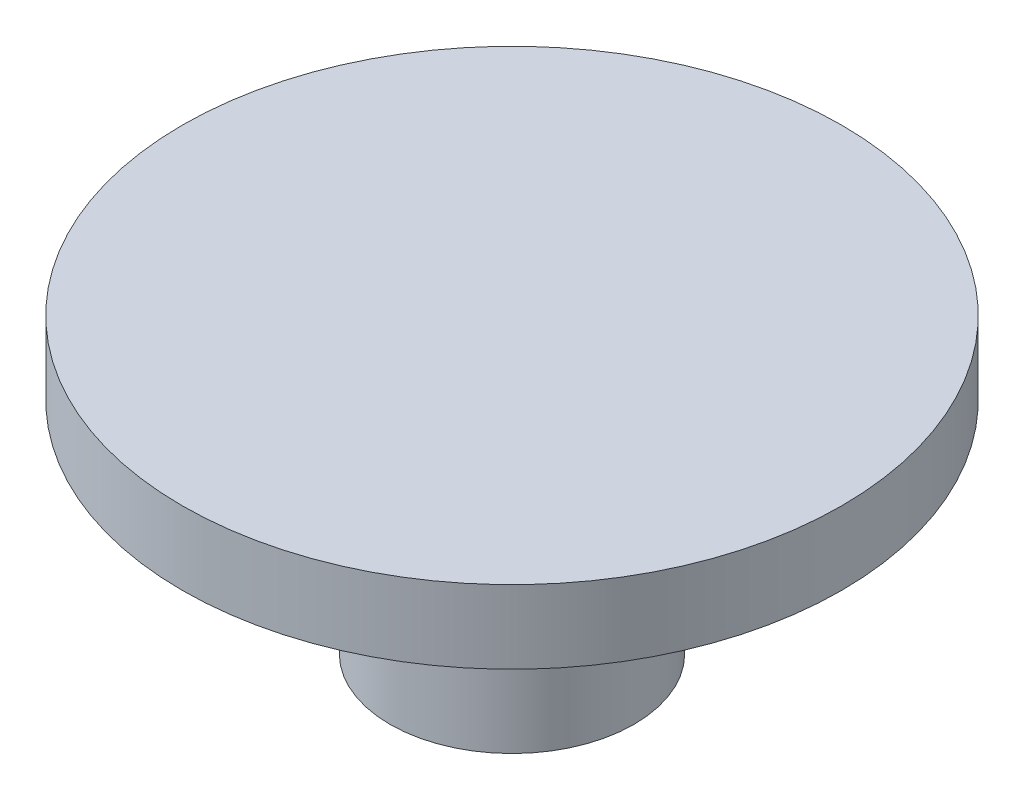
ISO-10303-21;
HEADER;
FILE_DESCRIPTION(('STEP AP214'),'2;1');
FILE_NAME('part.step','',(''),(''),'','','');
FILE_SCHEMA(('AUTOMOTIVE_DESIGN { 1 0 10303 214 1 1 1 1 }'));
ENDSEC;
DATA;
#1=APPLICATION_CONTEXT('core data for automotive mechanical design processes');
#2=APPLICATION_PROTOCOL_DEFINITION('international standard','automotive_design',2000,#1);
#3=PRODUCT_CONTEXT('',#1,'mechanical');
#4=PRODUCT('Part','Part','',(#3));
#5=PRODUCT_RELATED_PRODUCT_CATEGORY('part','',(#4));
#6=PRODUCT_DEFINITION_FORMATION('','',#4);
#7=PRODUCT_DEFINITION_CONTEXT('part definition',#1,'design');
#8=PRODUCT_DEFINITION('design','',#6,#7);
#9=PRODUCT_DEFINITION_SHAPE('','',#8);
#10=(LENGTH_UNIT() NAMED_UNIT(*) SI_UNIT(.MILLI.,.METRE.));
#11=(NAMED_UNIT(*) PLANE_ANGLE_UNIT() SI_UNIT($,.RADIAN.));
#12=(NAMED_UNIT(*) SI_UNIT($,.STERADIAN.) SOLID_ANGLE_UNIT());
#13=UNCERTAINTY_MEASURE_WITH_UNIT(LENGTH_MEASURE(1.E-05),#10,'distance_accuracy_value','');
#14=(GEOMETRIC_REPRESENTATION_CONTEXT(3) GLOBAL_UNCERTAINTY_ASSIGNED_CONTEXT((#13)) GLOBAL_UNIT_ASSIGNED_CONTEXT((#10,
#11,#12)) REPRESENTATION_CONTEXT('',''));
#15=CARTESIAN_POINT('',(0.,0.,0.));
#16=DIRECTION('',(0.,0.,1.));
#17=DIRECTION('',(1.,0.,0.));
#18=AXIS2_PLACEMENT_3D('',#15,#16,#17);
#19=CARTESIAN_POINT('',(0.,0.,0.));
#20=DIRECTION('',(0.,1.,0.));
#21=DIRECTION('',(0.,0.,1.));
#22=AXIS2_PLACEMENT_3D('',#19,#20,#21);
#23=PLANE('',#22);
#24=CARTESIAN_POINT('',(0.,0.,0.));
#25=DIRECTION('',(0.,1.,0.));
#26=DIRECTION('',(0.,0.,1.));
#27=AXIS2_PLACEMENT_3D('',#24,#25,#26);
#28=CIRCLE('',#27,5.);
#29=CARTESIAN_POINT('',(0.,0.,5.));
#30=VERTEX_POINT('',#29);
#31=EDGE_CURVE('E10',#30,#30,#28,.T.);
#32=ORIENTED_EDGE('',*,*,#31,.F.);
#33=EDGE_LOOP('',(#32));
#34=FACE_BOUND('',#33,.T.);
#35=ADVANCED_FACE('F40',(#34),#23,.F.);
#36=CARTESIAN_POINT('',(0.,12.,0.));
#37=DIRECTION('',(0.,1.,0.));
#38=DIRECTION('',(0.,0.,1.));
#39=AXIS2_PLACEMENT_3D('',#36,#37,#38);
#40=CYLINDRICAL_SURFACE('',#39,5.);
#41=CARTESIAN_POINT('',(0.,9.,0.));
#42=DIRECTION('',(0.,1.,0.));
#43=DIRECTION('',(0.,0.,1.));
#44=AXIS2_PLACEMENT_3D('',#41,#42,#43);
#45=CIRCLE('',#44,5.);
#46=CARTESIAN_POINT('',(0.,9.,5.));
#47=VERTEX_POINT('',#46);
#48=EDGE_CURVE('E43',#47,#47,#45,.T.);
#49=ORIENTED_EDGE('',*,*,#48,.F.);
#50=EDGE_LOOP('',(#49));
#51=FACE_BOUND('',#50,.T.);
#52=ORIENTED_EDGE('',*,*,#31,.T.);
#53=EDGE_LOOP('',(#52));
#54=FACE_BOUND('',#53,.T.);
#55=ADVANCED_FACE('F70',(#51,#54),#40,.T.);
#56=CARTESIAN_POINT('',(5.,9.,0.));
#57=DIRECTION('',(0.,1.,0.));
#58=DIRECTION('',(0.,0.,1.));
#59=AXIS2_PLACEMENT_3D('',#56,#57,#58);
#60=PLANE('',#59);
#61=CARTESIAN_POINT('',(0.,9.,0.));
#62=DIRECTION('',(0.,1.,0.));
#63=DIRECTION('',(0.,0.,1.));
#64=AXIS2_PLACEMENT_3D('',#61,#62,#63);
#65=CIRCLE('',#64,13.5);
#66=CARTESIAN_POINT('',(0.,9.,13.5));
#67=VERTEX_POINT('',#66);
#68=EDGE_CURVE('E50',#67,#67,#65,.T.);
#69=ORIENTED_EDGE('',*,*,#68,.F.);
#70=EDGE_LOOP('',(#69));
#71=FACE_BOUND('',#70,.T.);
#72=ORIENTED_EDGE('',*,*,#48,.T.);
#73=EDGE_LOOP('',(#72));
#74=FACE_BOUND('',#73,.T.);
#75=ADVANCED_FACE('F64',(#71,#74),#60,.F.);
#76=CARTESIAN_POINT('',(0.,12.,0.));
#77=DIRECTION('',(0.,1.,0.));
#78=DIRECTION('',(0.,0.,1.));
#79=AXIS2_PLACEMENT_3D('',#76,#77,#78);
#80=CYLINDRICAL_SURFACE('',#79,13.5);
#81=CARTESIAN_POINT('',(0.,12.,0.));
#82=DIRECTION('',(0.,1.,0.));
#83=DIRECTION('',(0.,0.,1.));
#84=AXIS2_PLACEMENT_3D('',#81,#82,#83);
#85=CIRCLE('',#84,13.5);
#86=CARTESIAN_POINT('',(0.,12.,13.5));
#87=VERTEX_POINT('',#86);
#88=EDGE_CURVE('E51',#87,#87,#85,.T.);
#89=ORIENTED_EDGE('',*,*,#88,.F.);
#90=EDGE_LOOP('',(#89));
#91=FACE_BOUND('',#90,.T.);
#92=ORIENTED_EDGE('',*,*,#68,.T.);
#93=EDGE_LOOP('',(#92));
#94=FACE_BOUND('',#93,.T.);
#95=ADVANCED_FACE('F56',(#91,#94),#80,.T.);
#96=CARTESIAN_POINT('',(13.5,12.,0.));
#97=DIRECTION('',(0.,-1.,0.));
#98=DIRECTION('',(0.,0.,-1.));
#99=AXIS2_PLACEMENT_3D('',#96,#97,#98);
#100=PLANE('',#99);
#101=ORIENTED_EDGE('',*,*,#88,.T.);
#102=EDGE_LOOP('',(#101));
#103=FACE_BOUND('',#102,.T.);
#104=ADVANCED_FACE('F60',(#103),#100,.F.);
#105=CLOSED_SHELL('',(#35,#55,#75,#95,#104));
#106=MANIFOLD_SOLID_BREP('B2',#105);
#107=ADVANCED_BREP_SHAPE_REPRESENTATION('',(#18,#106),#14);
#108=SHAPE_DEFINITION_REPRESENTATION(#9,#107);
ENDSEC;
END-ISO-10303-21;
